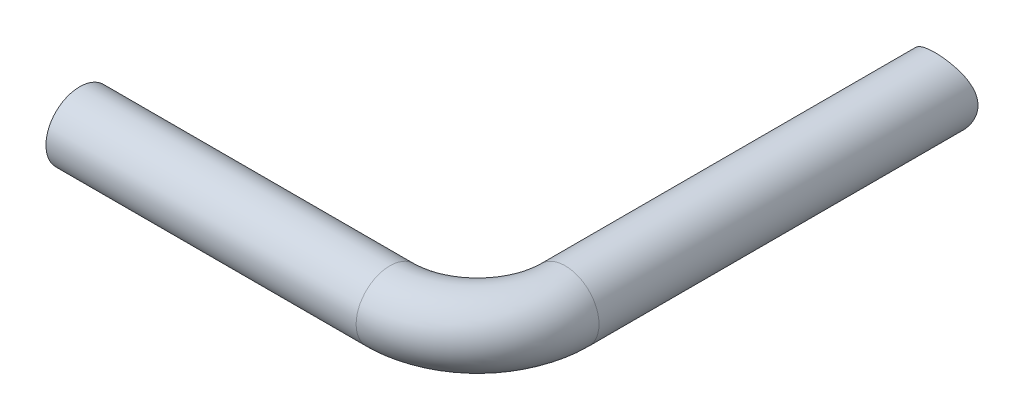
ISO-10303-21;
HEADER;
FILE_DESCRIPTION(('STEP AP214'),'2;1');
FILE_NAME('part.step','',(''),(''),'','','');
FILE_SCHEMA(('AUTOMOTIVE_DESIGN { 1 0 10303 214 1 1 1 1 }'));
ENDSEC;
DATA;
#1=APPLICATION_CONTEXT('core data for automotive mechanical design processes');
#2=APPLICATION_PROTOCOL_DEFINITION('international standard','automotive_design',2000,#1);
#3=PRODUCT_CONTEXT('',#1,'mechanical');
#4=PRODUCT('Part','Part','',(#3));
#5=PRODUCT_RELATED_PRODUCT_CATEGORY('part','',(#4));
#6=PRODUCT_DEFINITION_FORMATION('','',#4);
#7=PRODUCT_DEFINITION_CONTEXT('part definition',#1,'design');
#8=PRODUCT_DEFINITION('design','',#6,#7);
#9=PRODUCT_DEFINITION_SHAPE('','',#8);
#10=(LENGTH_UNIT() NAMED_UNIT(*) SI_UNIT(.MILLI.,.METRE.));
#11=(NAMED_UNIT(*) PLANE_ANGLE_UNIT() SI_UNIT($,.RADIAN.));
#12=(NAMED_UNIT(*) SI_UNIT($,.STERADIAN.) SOLID_ANGLE_UNIT());
#13=UNCERTAINTY_MEASURE_WITH_UNIT(LENGTH_MEASURE(1.E-05),#10,'distance_accuracy_value','');
#14=(GEOMETRIC_REPRESENTATION_CONTEXT(3) GLOBAL_UNCERTAINTY_ASSIGNED_CONTEXT((#13)) GLOBAL_UNIT_ASSIGNED_CONTEXT((#10,
#11,#12)) REPRESENTATION_CONTEXT('',''));
#15=CARTESIAN_POINT('',(0.,0.,0.));
#16=DIRECTION('',(0.,0.,1.));
#17=DIRECTION('',(1.,0.,0.));
#18=AXIS2_PLACEMENT_3D('',#15,#16,#17);
#19=CARTESIAN_POINT('',(22.14,0.535,-3.8));
#20=DIRECTION('',(-1.,0.,0.));
#21=DIRECTION('',(0.,0.,1.));
#22=AXIS2_PLACEMENT_3D('',#19,#20,#21);
#23=PLANE('',#22);
#24=CARTESIAN_POINT('',(22.14,0.535,-3.8));
#25=DIRECTION('',(1.,0.,0.));
#26=DIRECTION('',(0.,0.,-1.));
#27=AXIS2_PLACEMENT_3D('',#24,#25,#26);
#28=CIRCLE('',#27,0.435);
#29=CARTESIAN_POINT('',(22.14,0.535,-4.235));
#30=VERTEX_POINT('',#29);
#31=EDGE_CURVE('E17',#30,#30,#28,.T.);
#32=ORIENTED_EDGE('',*,*,#31,.F.);
#33=EDGE_LOOP('',(#32));
#34=FACE_BOUND('',#33,.T.);
#35=ADVANCED_FACE('F14',(#34),#23,.T.);
#36=CARTESIAN_POINT('',(24.14,0.535,-3.8));
#37=DIRECTION('',(1.,0.,0.));
#38=DIRECTION('',(0.,0.,-1.));
#39=AXIS2_PLACEMENT_3D('',#36,#37,#38);
#40=CYLINDRICAL_SURFACE('',#39,0.435);
#41=ORIENTED_EDGE('',*,*,#31,.T.);
#42=EDGE_LOOP('',(#41));
#43=FACE_BOUND('',#42,.T.);
#44=CARTESIAN_POINT('',(26.14,0.535,-3.8));
#45=DIRECTION('',(-1.,0.,0.));
#46=DIRECTION('',(0.,0.,1.));
#47=AXIS2_PLACEMENT_3D('',#44,#45,#46);
#48=CIRCLE('',#47,0.435);
#49=CARTESIAN_POINT('',(26.14,0.535,-3.365));
#50=VERTEX_POINT('',#49);
#51=EDGE_CURVE('E25',#50,#50,#48,.F.);
#52=ORIENTED_EDGE('',*,*,#51,.F.);
#53=EDGE_LOOP('',(#52));
#54=FACE_BOUND('',#53,.T.);
#55=ADVANCED_FACE('F49',(#43,#54),#40,.T.);
#56=CARTESIAN_POINT('',(26.14,0.535,-4.931));
#57=DIRECTION('',(0.,-1.,0.));
#58=DIRECTION('',(0.,0.,-1.));
#59=AXIS2_PLACEMENT_3D('',#56,#57,#58);
#60=TOROIDAL_SURFACE('',#59,1.131,0.435);
#61=ORIENTED_EDGE('',*,*,#51,.T.);
#62=EDGE_LOOP('',(#61));
#63=FACE_BOUND('',#62,.T.);
#64=CARTESIAN_POINT('',(27.271,0.535,-4.931));
#65=DIRECTION('',(0.,0.,1.));
#66=DIRECTION('',(1.,0.,0.));
#67=AXIS2_PLACEMENT_3D('',#64,#65,#66);
#68=CIRCLE('',#67,0.435);
#69=CARTESIAN_POINT('',(27.706,0.535,-4.931));
#70=VERTEX_POINT('',#69);
#71=EDGE_CURVE('E21',#70,#70,#68,.F.);
#72=ORIENTED_EDGE('',*,*,#71,.F.);
#73=EDGE_LOOP('',(#72));
#74=FACE_BOUND('',#73,.T.);
#75=ADVANCED_FACE('F43',(#63,#74),#60,.T.);
#76=CARTESIAN_POINT('',(27.271,2.665,-10.531));
#77=DIRECTION('',(0.,-1.,0.));
#78=DIRECTION('',(0.,0.,-1.));
#79=AXIS2_PLACEMENT_3D('',#76,#77,#78);
#80=CYLINDRICAL_SURFACE('',#79,0.835);
#81=CARTESIAN_POINT('',(27.706,0.535,-9.81825881275178));
#82=CARTESIAN_POINT('',(27.7059987577011,0.557531539298978,-9.81825715511864));
#83=CARTESIAN_POINT('',(27.7042388471647,0.580074548088419,-9.81717474964192));
#84=CARTESIAN_POINT('',(27.6972982507185,0.624446753584348,-9.81300962852608));
#85=CARTESIAN_POINT('',(27.6921134612012,0.646275060982126,-9.80992451336512));
#86=CARTESIAN_POINT('',(27.6786152975252,0.688505328848792,-9.80221044009595));
#87=CARTESIAN_POINT('',(27.6703187790503,0.708914284010678,-9.7975898146746));
#88=CARTESIAN_POINT('',(27.6508859410826,0.748048252238527,-9.78733875678622));
#89=CARTESIAN_POINT('',(27.6397488544875,0.766772808577965,-9.78170805166682));
#90=CARTESIAN_POINT('',(27.6137788976117,0.803858836425371,-9.76945452453862));
#91=CARTESIAN_POINT('',(27.5987037662908,0.822036290206287,-9.76278801887852));
#92=CARTESIAN_POINT('',(27.5657883109157,0.855749538924452,-9.74956569431973));
#93=CARTESIAN_POINT('',(27.5479465801155,0.871283981482768,-9.74300993362314));
#94=CARTESIAN_POINT('',(27.5083768107524,0.900410045606236,-9.73016232333238));
#95=CARTESIAN_POINT('',(27.4864579705967,0.913769670065479,-9.72392682352332));
#96=CARTESIAN_POINT('',(27.440297834958,0.936527050299975,-9.71299995589071));
#97=CARTESIAN_POINT('',(27.4160581405504,0.945927513533599,-9.70830753332216));
#98=CARTESIAN_POINT('',(27.3678997062425,0.959752053201865,-9.70131233528202));
#99=CARTESIAN_POINT('',(27.3440971152834,0.964500599254634,-9.69885478482599));
#100=CARTESIAN_POINT('',(27.29591647863,0.969960699304803,-9.69602394266475));
#101=CARTESIAN_POINT('',(27.2715388245594,0.970674925312739,-9.69564927142974));
#102=CARTESIAN_POINT('',(27.2253631559063,0.968158333497627,-9.6969582879888));
#103=CARTESIAN_POINT('',(27.2035384819696,0.965292846741769,-9.69845137920831));
#104=CARTESIAN_POINT('',(27.1607322081954,0.956359836247961,-9.70303295014414));
#105=CARTESIAN_POINT('',(27.1397506683558,0.95029208506806,-9.7061215431812));
#106=CARTESIAN_POINT('',(27.0988808077643,0.9351020676826,-9.7136642135435));
#107=CARTESIAN_POINT('',(27.0790098819727,0.925941761613907,-9.71813523472813));
#108=CARTESIAN_POINT('',(27.0410427067007,0.904886985466763,-9.72804906336641));
#109=CARTESIAN_POINT('',(27.0229470521978,0.892991603170859,-9.73349219490803));
#110=CARTESIAN_POINT('',(26.9871070268886,0.865440093260194,-9.74549271699671));
#111=CARTESIAN_POINT('',(26.9695795199527,0.849526574565917,-9.75210710694414));
#112=CARTESIAN_POINT('',(26.9373170432351,0.815068771598669,-9.76537237581507));
#113=CARTESIAN_POINT('',(26.9225849825378,0.796521781500466,-9.77202328541943));
#114=CARTESIAN_POINT('',(26.895263596947,0.755668819245117,-9.7851491906845));
#115=CARTESIAN_POINT('',(26.8829121578377,0.733186564405812,-9.79157511023531));
#116=CARTESIAN_POINT('',(26.862270096305,0.686071925228137,-9.80278001707897));
#117=CARTESIAN_POINT('',(26.853970612178,0.661444373077508,-9.80756259154703));
#118=CARTESIAN_POINT('',(26.8439843367178,0.6196725438641,-9.81343268079162));
#119=CARTESIAN_POINT('',(26.8409994979238,0.602929557179387,-9.81522772710457));
#120=CARTESIAN_POINT('',(26.8370071236666,0.569126516409981,-9.81764126343316));
#121=CARTESIAN_POINT('',(26.8359990590188,0.552066548416353,-9.81826006832851));
#122=CARTESIAN_POINT('',(26.8360012422989,0.512468460701021,-9.81825715511864));
#123=CARTESIAN_POINT('',(26.8377611528353,0.48992545191158,-9.81717474964192));
#124=CARTESIAN_POINT('',(26.8447017492815,0.445553246415652,-9.81300962852608));
#125=CARTESIAN_POINT('',(26.8498865387988,0.423724939017874,-9.80992451336512));
#126=CARTESIAN_POINT('',(26.8633847024748,0.381494671151208,-9.80221044009595));
#127=CARTESIAN_POINT('',(26.8716812209497,0.361085715989322,-9.7975898146746));
#128=CARTESIAN_POINT('',(26.8911140589174,0.321951747761473,-9.78733875678622));
#129=CARTESIAN_POINT('',(26.9022511455125,0.303227191422035,-9.78170805166682));
#130=CARTESIAN_POINT('',(26.9282211023883,0.266141163574626,-9.76945452453862));
#131=CARTESIAN_POINT('',(26.9432962337092,0.24796370979371,-9.76278801887852));
#132=CARTESIAN_POINT('',(26.9762116890843,0.214250461075546,-9.74956569431973));
#133=CARTESIAN_POINT('',(26.9940534198845,0.198716018517231,-9.74300993362314));
#134=CARTESIAN_POINT('',(27.0336231892476,0.169589954393764,-9.73016232333238));
#135=CARTESIAN_POINT('',(27.0555420294033,0.156230329934521,-9.72392682352332));
#136=CARTESIAN_POINT('',(27.101702165042,0.133472949700025,-9.71299995589071));
#137=CARTESIAN_POINT('',(27.1259418594496,0.124072486466401,-9.70830753332216));
#138=CARTESIAN_POINT('',(27.1741002937575,0.110247946798135,-9.70131233528202));
#139=CARTESIAN_POINT('',(27.1979028847166,0.105499400745365,-9.69885478482599));
#140=CARTESIAN_POINT('',(27.24608352137,0.100039300695197,-9.69602394266475));
#141=CARTESIAN_POINT('',(27.2704611754406,0.0993250746872614,-9.69564927142974));
#142=CARTESIAN_POINT('',(27.3166368440937,0.101841666502373,-9.6969582879888));
#143=CARTESIAN_POINT('',(27.3384615180304,0.104707153258231,-9.69845137920831));
#144=CARTESIAN_POINT('',(27.3812677918046,0.11364016375204,-9.70303295014414));
#145=CARTESIAN_POINT('',(27.4022493316442,0.119707914931941,-9.7061215431812));
#146=CARTESIAN_POINT('',(27.4431191922357,0.134897932317401,-9.71366421354349));
#147=CARTESIAN_POINT('',(27.4629901180273,0.144058238386093,-9.71813523472813));
#148=CARTESIAN_POINT('',(27.5009572932993,0.165113014533237,-9.72804906336641));
#149=CARTESIAN_POINT('',(27.5190529478022,0.177008396829141,-9.73349219490803));
#150=CARTESIAN_POINT('',(27.5548929731114,0.204559906739806,-9.74549271699671));
#151=CARTESIAN_POINT('',(27.5724204800473,0.220473425434083,-9.75210710694414));
#152=CARTESIAN_POINT('',(27.6046829567649,0.254931228401331,-9.76537237581507));
#153=CARTESIAN_POINT('',(27.6194150174622,0.273478218499534,-9.77202328541943));
#154=CARTESIAN_POINT('',(27.646736403053,0.314331180754883,-9.7851491906845));
#155=CARTESIAN_POINT('',(27.6590878421623,0.336813435594188,-9.79157511023531));
#156=CARTESIAN_POINT('',(27.679729903695,0.383928074771863,-9.80278001707897));
#157=CARTESIAN_POINT('',(27.688029387822,0.408555626922492,-9.80756259154703));
#158=CARTESIAN_POINT('',(27.6980156632822,0.450327456135901,-9.81343268079162));
#159=CARTESIAN_POINT('',(27.7010005020762,0.467070442820614,-9.81522772710457));
#160=CARTESIAN_POINT('',(27.7049928763334,0.50087348359002,-9.81764126343316));
#161=CARTESIAN_POINT('',(27.7060009409812,0.517933451583647,-9.81826006832851));
#162=CARTESIAN_POINT('',(27.706,0.535,-9.81825881275178));
#163=B_SPLINE_CURVE_WITH_KNOTS('',3,(#81,#82,#83,#84,#85,#86,#87,#88,#89,#90,#91,#92,#93,#94,
#95,#96,#97,#98,#99,#100,#101,#102,#103,#104,#105,#106,#107,#108,#109,#110,#111,#112,#113,#114,
#115,#116,#117,#118,#119,#120,#121,#122,#123,#124,#125,#126,#127,#128,#129,#130,#131,#132,#133,
#134,#135,#136,#137,#138,#139,#140,#141,#142,#143,#144,#145,#146,#147,#148,#149,#150,#151,#152,
#153,#154,#155,#156,#157,#158,#159,#160,#161,#162),.UNSPECIFIED.,.T.,.F.,(4,2,2,2,2,2,2,2,2,2,2,
2,2,2,2,2,2,2,2,2,2,2,2,2,2,2,2,2,2,2,2,2,2,2,2,2,2,2,2,2,4),(0.,0.0675245960565323,
0.135130245570082,0.202374855550346,0.269637644361371,0.342948157634362,0.416296070429321,
0.495126250755462,0.573902435466643,0.646679160741764,0.719407678884921,0.785284297932429,
0.851165596519652,0.917888726250874,0.984634142205973,1.05806718285008,1.13157622753409,
1.21050197155423,1.28925432148156,1.34041462612019,1.39156123322065,1.45908582927718,
1.52669147879073,1.593936088771,1.66119887758202,1.73450939085502,1.80785730364997,
1.88668748397611,1.96546366868729,2.03824039396242,2.11096891210557,2.17684553115309,
2.2427268297403,2.30944995947152,2.37619537542662,2.44962841607073,2.52313746075474,
2.60206320477488,2.68081555470221,2.73197585934084,2.7831224664413),.UNSPECIFIED.);
#164=CARTESIAN_POINT('',(27.706,0.535,-9.81825881275178));
#165=VERTEX_POINT('',#164);
#166=EDGE_CURVE('E10',#165,#165,#163,.T.);
#167=ORIENTED_EDGE('',*,*,#166,.F.);
#168=EDGE_LOOP('',(#167));
#169=FACE_BOUND('',#168,.T.);
#170=ADVANCED_FACE('F33',(#169),#80,.F.);
#171=CARTESIAN_POINT('',(27.271,0.535,-6.931));
#172=DIRECTION('',(0.,0.,1.));
#173=DIRECTION('',(1.,0.,0.));
#174=AXIS2_PLACEMENT_3D('',#171,#172,#173);
#175=CYLINDRICAL_SURFACE('',#174,0.435);
#176=ORIENTED_EDGE('',*,*,#166,.T.);
#177=EDGE_LOOP('',(#176));
#178=FACE_BOUND('',#177,.T.);
#179=ORIENTED_EDGE('',*,*,#71,.T.);
#180=EDGE_LOOP('',(#179));
#181=FACE_BOUND('',#180,.T.);
#182=ADVANCED_FACE('F36',(#178,#181),#175,.T.);
#183=CLOSED_SHELL('',(#35,#55,#75,#170,#182));
#184=MANIFOLD_SOLID_BREP('B1',#183);
#185=ADVANCED_BREP_SHAPE_REPRESENTATION('',(#18,#184),#14);
#186=SHAPE_DEFINITION_REPRESENTATION(#9,#185);
ENDSEC;
END-ISO-10303-21;
